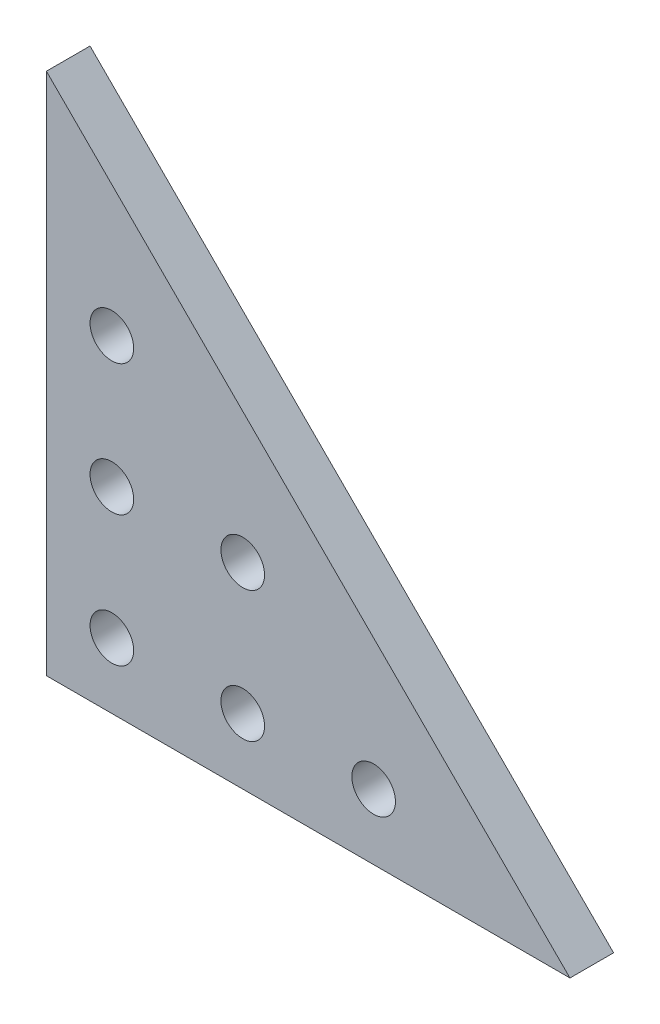
ISO-10303-21;
HEADER;
FILE_DESCRIPTION(('STEP AP214'),'2;1');
FILE_NAME('part.step','',(''),(''),'','','');
FILE_SCHEMA(('AUTOMOTIVE_DESIGN { 1 0 10303 214 1 1 1 1 }'));
ENDSEC;
DATA;
#1=APPLICATION_CONTEXT('core data for automotive mechanical design processes');
#2=APPLICATION_PROTOCOL_DEFINITION('international standard','automotive_design',2000,#1);
#3=PRODUCT_CONTEXT('',#1,'mechanical');
#4=PRODUCT('Part','Part','',(#3));
#5=PRODUCT_RELATED_PRODUCT_CATEGORY('part','',(#4));
#6=PRODUCT_DEFINITION_FORMATION('','',#4);
#7=PRODUCT_DEFINITION_CONTEXT('part definition',#1,'design');
#8=PRODUCT_DEFINITION('design','',#6,#7);
#9=PRODUCT_DEFINITION_SHAPE('','',#8);
#10=(LENGTH_UNIT() NAMED_UNIT(*) SI_UNIT(.MILLI.,.METRE.));
#11=(NAMED_UNIT(*) PLANE_ANGLE_UNIT() SI_UNIT($,.RADIAN.));
#12=(NAMED_UNIT(*) SI_UNIT($,.STERADIAN.) SOLID_ANGLE_UNIT());
#13=UNCERTAINTY_MEASURE_WITH_UNIT(LENGTH_MEASURE(1.E-05),#10,'distance_accuracy_value','');
#14=(GEOMETRIC_REPRESENTATION_CONTEXT(3) GLOBAL_UNCERTAINTY_ASSIGNED_CONTEXT((#13)) GLOBAL_UNIT_ASSIGNED_CONTEXT((#10,
#11,#12)) REPRESENTATION_CONTEXT('',''));
#15=CARTESIAN_POINT('',(0.,0.,0.));
#16=DIRECTION('',(0.,0.,1.));
#17=DIRECTION('',(1.,0.,0.));
#18=AXIS2_PLACEMENT_3D('',#15,#16,#17);
#19=CARTESIAN_POINT('',(0.,0.,3.));
#20=DIRECTION('',(0.,0.,1.));
#21=DIRECTION('',(1.,0.,0.));
#22=AXIS2_PLACEMENT_3D('',#19,#20,#21);
#23=PLANE('',#22);
#24=CARTESIAN_POINT('',(-92.443383637,74.056539338,3.));
#25=DIRECTION('',(0.,0.,1.));
#26=DIRECTION('',(1.,0.,0.));
#27=AXIS2_PLACEMENT_3D('',#24,#25,#26);
#28=CIRCLE('',#27,1.5);
#29=CARTESIAN_POINT('',(-90.943383637,74.056539338,3.));
#30=VERTEX_POINT('',#29);
#31=EDGE_CURVE('E117',#30,#30,#28,.T.);
#32=ORIENTED_EDGE('',*,*,#31,.F.);
#33=EDGE_LOOP('',(#32));
#34=FACE_BOUND('',#33,.T.);
#35=CARTESIAN_POINT('',(-92.443383637,83.056539338,3.));
#36=DIRECTION('',(0.,0.,1.));
#37=DIRECTION('',(1.,0.,0.));
#38=AXIS2_PLACEMENT_3D('',#35,#36,#37);
#39=CIRCLE('',#38,1.5);
#40=CARTESIAN_POINT('',(-90.943383637,83.056539338,3.));
#41=VERTEX_POINT('',#40);
#42=EDGE_CURVE('E127',#41,#41,#39,.T.);
#43=ORIENTED_EDGE('',*,*,#42,.F.);
#44=EDGE_LOOP('',(#43));
#45=FACE_BOUND('',#44,.T.);
#46=CARTESIAN_POINT('',(-101.443383637,92.056539338,3.));
#47=DIRECTION('',(0.,0.,1.));
#48=DIRECTION('',(1.,0.,0.));
#49=AXIS2_PLACEMENT_3D('',#46,#47,#48);
#50=CIRCLE('',#49,1.5);
#51=CARTESIAN_POINT('',(-99.943383637,92.056539338,3.));
#52=VERTEX_POINT('',#51);
#53=EDGE_CURVE('E84',#52,#52,#50,.T.);
#54=ORIENTED_EDGE('',*,*,#53,.F.);
#55=EDGE_LOOP('',(#54));
#56=FACE_BOUND('',#55,.T.);
#57=DIRECTION('',(-0.707106781186547,0.707106781186547,0.));
#58=VECTOR('',#57,1.);
#59=CARTESIAN_POINT('',(-105.943383637,105.556539338,3.));
#60=LINE('',#59,#58);
#61=CARTESIAN_POINT('',(-69.943383637,69.556539338,3.));
#62=VERTEX_POINT('',#61);
#63=CARTESIAN_POINT('',(-105.943383637,105.556539338,3.));
#64=VERTEX_POINT('',#63);
#65=EDGE_CURVE('E74',#62,#64,#60,.T.);
#66=ORIENTED_EDGE('',*,*,#65,.T.);
#67=DIRECTION('',(0.,-1.,0.));
#68=VECTOR('',#67,1.);
#69=CARTESIAN_POINT('',(-105.943383637,105.556539338,3.));
#70=LINE('',#69,#68);
#71=CARTESIAN_POINT('',(-105.943383637,69.556539338,3.));
#72=VERTEX_POINT('',#71);
#73=EDGE_CURVE('E70',#64,#72,#70,.T.);
#74=ORIENTED_EDGE('',*,*,#73,.T.);
#75=DIRECTION('',(1.,0.,0.));
#76=VECTOR('',#75,1.);
#77=CARTESIAN_POINT('',(-105.943383637,69.556539338,3.));
#78=LINE('',#77,#76);
#79=EDGE_CURVE('E50',#72,#62,#78,.T.);
#80=ORIENTED_EDGE('',*,*,#79,.T.);
#81=EDGE_LOOP('',(#66,#74,#80));
#82=FACE_BOUND('',#81,.T.);
#83=CARTESIAN_POINT('',(-101.443383637,83.056539338,3.));
#84=DIRECTION('',(0.,0.,1.));
#85=DIRECTION('',(1.,0.,0.));
#86=AXIS2_PLACEMENT_3D('',#83,#84,#85);
#87=CIRCLE('',#86,1.5);
#88=CARTESIAN_POINT('',(-99.943383637,83.056539338,3.));
#89=VERTEX_POINT('',#88);
#90=EDGE_CURVE('E132',#89,#89,#87,.T.);
#91=ORIENTED_EDGE('',*,*,#90,.F.);
#92=EDGE_LOOP('',(#91));
#93=FACE_BOUND('',#92,.T.);
#94=CARTESIAN_POINT('',(-101.443383637,74.056539338,3.));
#95=DIRECTION('',(0.,0.,1.));
#96=DIRECTION('',(1.,0.,0.));
#97=AXIS2_PLACEMENT_3D('',#94,#95,#96);
#98=CIRCLE('',#97,1.5);
#99=CARTESIAN_POINT('',(-99.943383637,74.056539338,3.));
#100=VERTEX_POINT('',#99);
#101=EDGE_CURVE('E122',#100,#100,#98,.T.);
#102=ORIENTED_EDGE('',*,*,#101,.F.);
#103=EDGE_LOOP('',(#102));
#104=FACE_BOUND('',#103,.T.);
#105=CARTESIAN_POINT('',(-83.443383637,74.056539338,3.));
#106=DIRECTION('',(0.,0.,1.));
#107=DIRECTION('',(1.,0.,0.));
#108=AXIS2_PLACEMENT_3D('',#105,#106,#107);
#109=CIRCLE('',#108,1.5);
#110=CARTESIAN_POINT('',(-81.943383637,74.056539338,3.));
#111=VERTEX_POINT('',#110);
#112=EDGE_CURVE('E111',#111,#111,#109,.T.);
#113=ORIENTED_EDGE('',*,*,#112,.F.);
#114=EDGE_LOOP('',(#113));
#115=FACE_BOUND('',#114,.T.);
#116=ADVANCED_FACE('F33',(#34,#45,#56,#82,#93,#104,#115),#23,.T.);
#117=CARTESIAN_POINT('',(0.,0.,0.));
#118=DIRECTION('',(0.,0.,1.));
#119=DIRECTION('',(1.,0.,0.));
#120=AXIS2_PLACEMENT_3D('',#117,#118,#119);
#121=PLANE('',#120);
#122=CARTESIAN_POINT('',(-92.443383637,74.056539338,0.));
#123=DIRECTION('',(0.,0.,1.));
#124=DIRECTION('',(1.,0.,0.));
#125=AXIS2_PLACEMENT_3D('',#122,#123,#124);
#126=CIRCLE('',#125,1.5);
#127=CARTESIAN_POINT('',(-90.943383637,74.056539338,0.));
#128=VERTEX_POINT('',#127);
#129=EDGE_CURVE('E114',#128,#128,#126,.T.);
#130=ORIENTED_EDGE('',*,*,#129,.T.);
#131=EDGE_LOOP('',(#130));
#132=FACE_BOUND('',#131,.T.);
#133=CARTESIAN_POINT('',(-92.443383637,83.056539338,0.));
#134=DIRECTION('',(0.,0.,1.));
#135=DIRECTION('',(1.,0.,0.));
#136=AXIS2_PLACEMENT_3D('',#133,#134,#135);
#137=CIRCLE('',#136,1.5);
#138=CARTESIAN_POINT('',(-90.943383637,83.056539338,0.));
#139=VERTEX_POINT('',#138);
#140=EDGE_CURVE('E125',#139,#139,#137,.T.);
#141=ORIENTED_EDGE('',*,*,#140,.T.);
#142=EDGE_LOOP('',(#141));
#143=FACE_BOUND('',#142,.T.);
#144=CARTESIAN_POINT('',(-101.443383637,92.056539338,0.));
#145=DIRECTION('',(0.,0.,1.));
#146=DIRECTION('',(1.,0.,0.));
#147=AXIS2_PLACEMENT_3D('',#144,#145,#146);
#148=CIRCLE('',#147,1.5);
#149=CARTESIAN_POINT('',(-99.943383637,92.056539338,0.));
#150=VERTEX_POINT('',#149);
#151=EDGE_CURVE('E88',#150,#150,#148,.T.);
#152=ORIENTED_EDGE('',*,*,#151,.T.);
#153=EDGE_LOOP('',(#152));
#154=FACE_BOUND('',#153,.T.);
#155=DIRECTION('',(-0.707106781186547,0.707106781186547,0.));
#156=VECTOR('',#155,1.);
#157=CARTESIAN_POINT('',(-105.943383637,105.556539338,0.));
#158=LINE('',#157,#156);
#159=CARTESIAN_POINT('',(-69.943383637,69.556539338,0.));
#160=VERTEX_POINT('',#159);
#161=CARTESIAN_POINT('',(-105.943383637,105.556539338,0.));
#162=VERTEX_POINT('',#161);
#163=EDGE_CURVE('E81',#160,#162,#158,.T.);
#164=ORIENTED_EDGE('',*,*,#163,.F.);
#165=DIRECTION('',(1.,0.,0.));
#166=VECTOR('',#165,1.);
#167=CARTESIAN_POINT('',(-105.943383637,69.556539338,0.));
#168=LINE('',#167,#166);
#169=CARTESIAN_POINT('',(-105.943383637,69.556539338,0.));
#170=VERTEX_POINT('',#169);
#171=EDGE_CURVE('E67',#170,#160,#168,.T.);
#172=ORIENTED_EDGE('',*,*,#171,.F.);
#173=DIRECTION('',(0.,-1.,0.));
#174=VECTOR('',#173,1.);
#175=CARTESIAN_POINT('',(-105.943383637,105.556539338,0.));
#176=LINE('',#175,#174);
#177=EDGE_CURVE('E62',#162,#170,#176,.T.);
#178=ORIENTED_EDGE('',*,*,#177,.F.);
#179=EDGE_LOOP('',(#164,#172,#178));
#180=FACE_BOUND('',#179,.T.);
#181=CARTESIAN_POINT('',(-101.443383637,83.056539338,0.));
#182=DIRECTION('',(0.,0.,1.));
#183=DIRECTION('',(1.,0.,0.));
#184=AXIS2_PLACEMENT_3D('',#181,#182,#183);
#185=CIRCLE('',#184,1.5);
#186=CARTESIAN_POINT('',(-99.943383637,83.056539338,0.));
#187=VERTEX_POINT('',#186);
#188=EDGE_CURVE('E102',#187,#187,#185,.T.);
#189=ORIENTED_EDGE('',*,*,#188,.T.);
#190=EDGE_LOOP('',(#189));
#191=FACE_BOUND('',#190,.T.);
#192=CARTESIAN_POINT('',(-101.443383637,74.056539338,0.));
#193=DIRECTION('',(0.,0.,1.));
#194=DIRECTION('',(1.,0.,0.));
#195=AXIS2_PLACEMENT_3D('',#192,#193,#194);
#196=CIRCLE('',#195,1.5);
#197=CARTESIAN_POINT('',(-99.943383637,74.056539338,0.));
#198=VERTEX_POINT('',#197);
#199=EDGE_CURVE('E106',#198,#198,#196,.T.);
#200=ORIENTED_EDGE('',*,*,#199,.T.);
#201=EDGE_LOOP('',(#200));
#202=FACE_BOUND('',#201,.T.);
#203=CARTESIAN_POINT('',(-83.443383637,74.056539338,0.));
#204=DIRECTION('',(0.,0.,1.));
#205=DIRECTION('',(1.,0.,0.));
#206=AXIS2_PLACEMENT_3D('',#203,#204,#205);
#207=CIRCLE('',#206,1.5);
#208=CARTESIAN_POINT('',(-81.943383637,74.056539338,0.));
#209=VERTEX_POINT('',#208);
#210=EDGE_CURVE('E109',#209,#209,#207,.T.);
#211=ORIENTED_EDGE('',*,*,#210,.T.);
#212=EDGE_LOOP('',(#211));
#213=FACE_BOUND('',#212,.T.);
#214=ADVANCED_FACE('F94',(#132,#143,#154,#180,#191,#202,#213),#121,.F.);
#215=CARTESIAN_POINT('',(-105.943383637,105.556539338,3.));
#216=DIRECTION('',(-0.707106781186548,-0.707106781186548,0.));
#217=DIRECTION('',(0.707106781186548,-0.707106781186548,0.));
#218=AXIS2_PLACEMENT_3D('',#215,#216,#217);
#219=PLANE('',#218);
#220=ORIENTED_EDGE('',*,*,#163,.T.);
#221=DIRECTION('',(0.,0.,-1.));
#222=VECTOR('',#221,1.);
#223=CARTESIAN_POINT('',(-105.943383637,105.556539338,3.));
#224=LINE('',#223,#222);
#225=EDGE_CURVE('E11',#64,#162,#224,.T.);
#226=ORIENTED_EDGE('',*,*,#225,.F.);
#227=ORIENTED_EDGE('',*,*,#65,.F.);
#228=DIRECTION('',(0.,0.,-1.));
#229=VECTOR('',#228,1.);
#230=CARTESIAN_POINT('',(-69.943383637,69.556539338,3.));
#231=LINE('',#230,#229);
#232=EDGE_CURVE('E82',#62,#160,#231,.T.);
#233=ORIENTED_EDGE('',*,*,#232,.T.);
#234=EDGE_LOOP('',(#220,#226,#227,#233));
#235=FACE_BOUND('',#234,.T.);
#236=ADVANCED_FACE('F35',(#235),#219,.F.);
#237=CARTESIAN_POINT('',(-105.943383637,105.556539338,3.));
#238=DIRECTION('',(1.,0.,0.));
#239=DIRECTION('',(0.,0.,-1.));
#240=AXIS2_PLACEMENT_3D('',#237,#238,#239);
#241=PLANE('',#240);
#242=ORIENTED_EDGE('',*,*,#177,.T.);
#243=DIRECTION('',(0.,0.,-1.));
#244=VECTOR('',#243,1.);
#245=CARTESIAN_POINT('',(-105.943383637,69.556539338,3.));
#246=LINE('',#245,#244);
#247=EDGE_CURVE('E42',#72,#170,#246,.T.);
#248=ORIENTED_EDGE('',*,*,#247,.F.);
#249=ORIENTED_EDGE('',*,*,#73,.F.);
#250=ORIENTED_EDGE('',*,*,#225,.T.);
#251=EDGE_LOOP('',(#242,#248,#249,#250));
#252=FACE_BOUND('',#251,.T.);
#253=ADVANCED_FACE('F71',(#252),#241,.F.);
#254=CARTESIAN_POINT('',(-105.943383637,69.556539338,3.));
#255=DIRECTION('',(0.,1.,0.));
#256=DIRECTION('',(0.,0.,1.));
#257=AXIS2_PLACEMENT_3D('',#254,#255,#256);
#258=PLANE('',#257);
#259=ORIENTED_EDGE('',*,*,#171,.T.);
#260=ORIENTED_EDGE('',*,*,#232,.F.);
#261=ORIENTED_EDGE('',*,*,#79,.F.);
#262=ORIENTED_EDGE('',*,*,#247,.T.);
#263=EDGE_LOOP('',(#259,#260,#261,#262));
#264=FACE_BOUND('',#263,.T.);
#265=ADVANCED_FACE('F93',(#264),#258,.F.);
#266=CARTESIAN_POINT('',(-101.443383637,92.056539338,3.));
#267=DIRECTION('',(0.,0.,-1.));
#268=DIRECTION('',(-1.,0.,0.));
#269=AXIS2_PLACEMENT_3D('',#266,#267,#268);
#270=CYLINDRICAL_SURFACE('',#269,1.5);
#271=ORIENTED_EDGE('',*,*,#53,.T.);
#272=EDGE_LOOP('',(#271));
#273=FACE_BOUND('',#272,.T.);
#274=ORIENTED_EDGE('',*,*,#151,.F.);
#275=EDGE_LOOP('',(#274));
#276=FACE_BOUND('',#275,.T.);
#277=ADVANCED_FACE('F140',(#273,#276),#270,.F.);
#278=CARTESIAN_POINT('',(-101.443383637,83.056539338,3.));
#279=DIRECTION('',(0.,0.,-1.));
#280=DIRECTION('',(-1.,0.,0.));
#281=AXIS2_PLACEMENT_3D('',#278,#279,#280);
#282=CYLINDRICAL_SURFACE('',#281,1.5);
#283=ORIENTED_EDGE('',*,*,#90,.T.);
#284=EDGE_LOOP('',(#283));
#285=FACE_BOUND('',#284,.T.);
#286=ORIENTED_EDGE('',*,*,#188,.F.);
#287=EDGE_LOOP('',(#286));
#288=FACE_BOUND('',#287,.T.);
#289=ADVANCED_FACE('F142',(#285,#288),#282,.F.);
#290=CARTESIAN_POINT('',(-92.443383637,83.056539338,3.));
#291=DIRECTION('',(0.,0.,-1.));
#292=DIRECTION('',(-1.,0.,0.));
#293=AXIS2_PLACEMENT_3D('',#290,#291,#292);
#294=CYLINDRICAL_SURFACE('',#293,1.5);
#295=ORIENTED_EDGE('',*,*,#42,.T.);
#296=EDGE_LOOP('',(#295));
#297=FACE_BOUND('',#296,.T.);
#298=ORIENTED_EDGE('',*,*,#140,.F.);
#299=EDGE_LOOP('',(#298));
#300=FACE_BOUND('',#299,.T.);
#301=ADVANCED_FACE('F149',(#297,#300),#294,.F.);
#302=CARTESIAN_POINT('',(-101.443383637,74.056539338,3.));
#303=DIRECTION('',(0.,0.,-1.));
#304=DIRECTION('',(-1.,0.,0.));
#305=AXIS2_PLACEMENT_3D('',#302,#303,#304);
#306=CYLINDRICAL_SURFACE('',#305,1.5);
#307=ORIENTED_EDGE('',*,*,#101,.T.);
#308=EDGE_LOOP('',(#307));
#309=FACE_BOUND('',#308,.T.);
#310=ORIENTED_EDGE('',*,*,#199,.F.);
#311=EDGE_LOOP('',(#310));
#312=FACE_BOUND('',#311,.T.);
#313=ADVANCED_FACE('F204',(#309,#312),#306,.F.);
#314=CARTESIAN_POINT('',(-92.443383637,74.056539338,3.));
#315=DIRECTION('',(0.,0.,-1.));
#316=DIRECTION('',(-1.,0.,0.));
#317=AXIS2_PLACEMENT_3D('',#314,#315,#316);
#318=CYLINDRICAL_SURFACE('',#317,1.5);
#319=ORIENTED_EDGE('',*,*,#31,.T.);
#320=EDGE_LOOP('',(#319));
#321=FACE_BOUND('',#320,.T.);
#322=ORIENTED_EDGE('',*,*,#129,.F.);
#323=EDGE_LOOP('',(#322));
#324=FACE_BOUND('',#323,.T.);
#325=ADVANCED_FACE('F213',(#321,#324),#318,.F.);
#326=CARTESIAN_POINT('',(-83.443383637,74.056539338,3.));
#327=DIRECTION('',(0.,0.,-1.));
#328=DIRECTION('',(-1.,0.,0.));
#329=AXIS2_PLACEMENT_3D('',#326,#327,#328);
#330=CYLINDRICAL_SURFACE('',#329,1.5);
#331=ORIENTED_EDGE('',*,*,#112,.T.);
#332=EDGE_LOOP('',(#331));
#333=FACE_BOUND('',#332,.T.);
#334=ORIENTED_EDGE('',*,*,#210,.F.);
#335=EDGE_LOOP('',(#334));
#336=FACE_BOUND('',#335,.T.);
#337=ADVANCED_FACE('F222',(#333,#336),#330,.F.);
#338=CLOSED_SHELL('',(#116,#214,#236,#253,#265,#277,#289,#301,#313,#325,#337));
#339=MANIFOLD_SOLID_BREP('B2',#338);
#340=ADVANCED_BREP_SHAPE_REPRESENTATION('',(#18,#339),#14);
#341=SHAPE_DEFINITION_REPRESENTATION(#9,#340);
ENDSEC;
END-ISO-10303-21;
